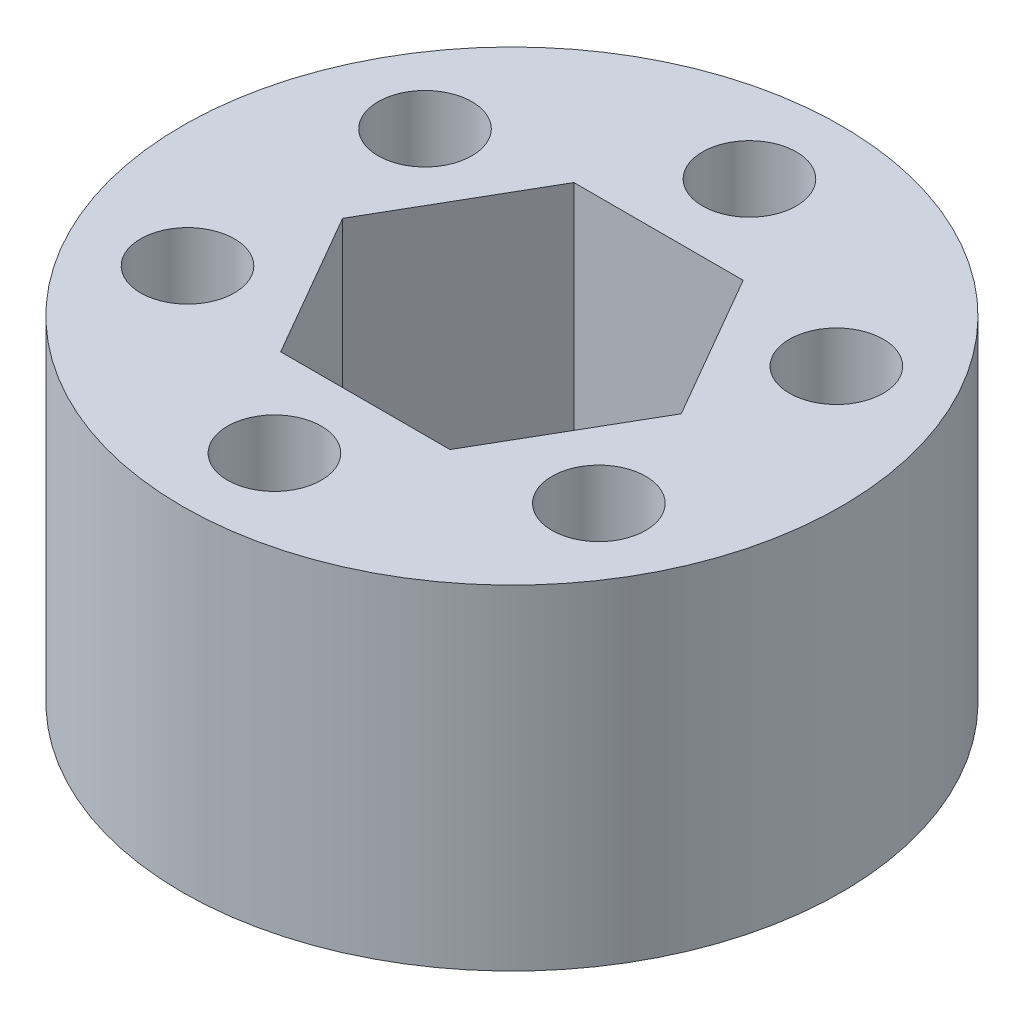
ISO-10303-21;
HEADER;
FILE_DESCRIPTION(('STEP AP214'),'2;1');
FILE_NAME('part.step','',(''),(''),'','','');
FILE_SCHEMA(('AUTOMOTIVE_DESIGN { 1 0 10303 214 1 1 1 1 }'));
ENDSEC;
DATA;
#1=APPLICATION_CONTEXT('core data for automotive mechanical design processes');
#2=APPLICATION_PROTOCOL_DEFINITION('international standard','automotive_design',2000,#1);
#3=PRODUCT_CONTEXT('',#1,'mechanical');
#4=PRODUCT('Part','Part','',(#3));
#5=PRODUCT_RELATED_PRODUCT_CATEGORY('part','',(#4));
#6=PRODUCT_DEFINITION_FORMATION('','',#4);
#7=PRODUCT_DEFINITION_CONTEXT('part definition',#1,'design');
#8=PRODUCT_DEFINITION('design','',#6,#7);
#9=PRODUCT_DEFINITION_SHAPE('','',#8);
#10=(LENGTH_UNIT() NAMED_UNIT(*) SI_UNIT(.MILLI.,.METRE.));
#11=(NAMED_UNIT(*) PLANE_ANGLE_UNIT() SI_UNIT($,.RADIAN.));
#12=(NAMED_UNIT(*) SI_UNIT($,.STERADIAN.) SOLID_ANGLE_UNIT());
#13=UNCERTAINTY_MEASURE_WITH_UNIT(LENGTH_MEASURE(1.E-05),#10,'distance_accuracy_value','');
#14=(GEOMETRIC_REPRESENTATION_CONTEXT(3) GLOBAL_UNCERTAINTY_ASSIGNED_CONTEXT((#13)) GLOBAL_UNIT_ASSIGNED_CONTEXT((#10,
#11,#12)) REPRESENTATION_CONTEXT('',''));
#15=CARTESIAN_POINT('',(0.,0.,0.));
#16=DIRECTION('',(0.,0.,1.));
#17=DIRECTION('',(1.,0.,0.));
#18=AXIS2_PLACEMENT_3D('',#15,#16,#17);
#19=CARTESIAN_POINT('',(0.,14.478,0.));
#20=DIRECTION('',(0.,1.,0.));
#21=DIRECTION('',(0.,0.,1.));
#22=AXIS2_PLACEMENT_3D('',#19,#20,#21);
#23=PLANE('',#22);
#24=CARTESIAN_POINT('',(-8.9088033287305,14.478,5.14350000000005));
#25=DIRECTION('',(0.,1.,0.));
#26=DIRECTION('',(0.,0.,1.));
#27=AXIS2_PLACEMENT_3D('',#24,#25,#26);
#28=CIRCLE('',#27,2.032);
#29=CARTESIAN_POINT('',(-8.9088033287305,14.478,7.17550000000004));
#30=VERTEX_POINT('',#29);
#31=EDGE_CURVE('E143',#30,#30,#28,.T.);
#32=ORIENTED_EDGE('',*,*,#31,.F.);
#33=EDGE_LOOP('',(#32));
#34=FACE_BOUND('',#33,.T.);
#35=CARTESIAN_POINT('',(8.90880332873054,14.478,5.14349999999998));
#36=DIRECTION('',(0.,1.,0.));
#37=DIRECTION('',(0.,0.,1.));
#38=AXIS2_PLACEMENT_3D('',#35,#36,#37);
#39=CIRCLE('',#38,2.032);
#40=CARTESIAN_POINT('',(8.90880332873054,14.478,7.17549999999998));
#41=VERTEX_POINT('',#40);
#42=EDGE_CURVE('E155',#41,#41,#39,.T.);
#43=ORIENTED_EDGE('',*,*,#42,.F.);
#44=EDGE_LOOP('',(#43));
#45=FACE_BOUND('',#44,.T.);
#46=CARTESIAN_POINT('',(0.,14.478,-10.287));
#47=DIRECTION('',(0.,1.,0.));
#48=DIRECTION('',(0.,0.,1.));
#49=AXIS2_PLACEMENT_3D('',#46,#47,#48);
#50=CIRCLE('',#49,2.032);
#51=CARTESIAN_POINT('',(0.,14.478,-8.255));
#52=VERTEX_POINT('',#51);
#53=EDGE_CURVE('E167',#52,#52,#50,.T.);
#54=ORIENTED_EDGE('',*,*,#53,.F.);
#55=EDGE_LOOP('',(#54));
#56=FACE_BOUND('',#55,.T.);
#57=CARTESIAN_POINT('',(0.,14.478,0.));
#58=DIRECTION('',(0.,1.,0.));
#59=DIRECTION('',(0.,0.,1.));
#60=AXIS2_PLACEMENT_3D('',#57,#58,#59);
#61=CIRCLE('',#60,14.2748);
#62=CARTESIAN_POINT('',(0.,14.478,14.2748));
#63=VERTEX_POINT('',#62);
#64=EDGE_CURVE('E11',#63,#63,#61,.T.);
#65=ORIENTED_EDGE('',*,*,#64,.T.);
#66=EDGE_LOOP('',(#65));
#67=FACE_BOUND('',#66,.T.);
#68=CARTESIAN_POINT('',(8.90880332873049,14.478,-5.14350000000005));
#69=DIRECTION('',(0.,1.,0.));
#70=DIRECTION('',(0.,0.,1.));
#71=AXIS2_PLACEMENT_3D('',#68,#69,#70);
#72=CIRCLE('',#71,2.032);
#73=CARTESIAN_POINT('',(8.90880332873049,14.478,-3.11150000000005));
#74=VERTEX_POINT('',#73);
#75=EDGE_CURVE('E161',#74,#74,#72,.T.);
#76=ORIENTED_EDGE('',*,*,#75,.F.);
#77=EDGE_LOOP('',(#76));
#78=FACE_BOUND('',#77,.T.);
#79=CARTESIAN_POINT('',(0.,14.478,10.287));
#80=DIRECTION('',(0.,1.,0.));
#81=DIRECTION('',(0.,0.,1.));
#82=AXIS2_PLACEMENT_3D('',#79,#80,#81);
#83=CIRCLE('',#82,2.032);
#84=CARTESIAN_POINT('',(0.,14.478,12.319));
#85=VERTEX_POINT('',#84);
#86=EDGE_CURVE('E149',#85,#85,#83,.T.);
#87=ORIENTED_EDGE('',*,*,#86,.F.);
#88=EDGE_LOOP('',(#87));
#89=FACE_BOUND('',#88,.T.);
#90=CARTESIAN_POINT('',(-8.90880332873054,14.478,-5.14349999999998));
#91=DIRECTION('',(0.,1.,0.));
#92=DIRECTION('',(0.,0.,1.));
#93=AXIS2_PLACEMENT_3D('',#90,#91,#92);
#94=CIRCLE('',#93,2.032);
#95=CARTESIAN_POINT('',(-8.90880332873054,14.478,-3.11149999999998));
#96=VERTEX_POINT('',#95);
#97=EDGE_CURVE('E137',#96,#96,#94,.T.);
#98=ORIENTED_EDGE('',*,*,#97,.F.);
#99=EDGE_LOOP('',(#98));
#100=FACE_BOUND('',#99,.T.);
#101=DIRECTION('',(-0.5,0.,-0.866025403784438));
#102=VECTOR('',#101,1.);
#103=CARTESIAN_POINT('',(7.33234841870825,14.478,0.));
#104=LINE('',#103,#102);
#105=CARTESIAN_POINT('',(7.33234841870825,14.478,0.));
#106=VERTEX_POINT('',#105);
#107=CARTESIAN_POINT('',(3.66617420935412,14.478,-6.35));
#108=VERTEX_POINT('',#107);
#109=EDGE_CURVE('E94',#106,#108,#104,.T.);
#110=ORIENTED_EDGE('',*,*,#109,.F.);
#111=DIRECTION('',(0.5,0.,-0.866025403784439));
#112=VECTOR('',#111,1.);
#113=CARTESIAN_POINT('',(3.66617420935413,14.478,6.35));
#114=LINE('',#113,#112);
#115=CARTESIAN_POINT('',(3.66617420935413,14.478,6.35));
#116=VERTEX_POINT('',#115);
#117=EDGE_CURVE('E86',#116,#106,#114,.T.);
#118=ORIENTED_EDGE('',*,*,#117,.F.);
#119=DIRECTION('',(1.,0.,0.));
#120=VECTOR('',#119,1.);
#121=CARTESIAN_POINT('',(-3.66617420935412,14.478,6.35));
#122=LINE('',#121,#120);
#123=CARTESIAN_POINT('',(-3.66617420935412,14.478,6.35));
#124=VERTEX_POINT('',#123);
#125=EDGE_CURVE('E115',#124,#116,#122,.T.);
#126=ORIENTED_EDGE('',*,*,#125,.F.);
#127=DIRECTION('',(0.5,0.,0.866025403784438));
#128=VECTOR('',#127,1.);
#129=CARTESIAN_POINT('',(-7.33234841870825,14.478,0.));
#130=LINE('',#129,#128);
#131=CARTESIAN_POINT('',(-7.33234841870825,14.478,0.));
#132=VERTEX_POINT('',#131);
#133=EDGE_CURVE('E113',#132,#124,#130,.T.);
#134=ORIENTED_EDGE('',*,*,#133,.F.);
#135=DIRECTION('',(-0.5,0.,0.866025403784439));
#136=VECTOR('',#135,1.);
#137=CARTESIAN_POINT('',(-3.66617420935412,14.478,-6.35));
#138=LINE('',#137,#136);
#139=CARTESIAN_POINT('',(-3.66617420935412,14.478,-6.35));
#140=VERTEX_POINT('',#139);
#141=EDGE_CURVE('E109',#140,#132,#138,.T.);
#142=ORIENTED_EDGE('',*,*,#141,.F.);
#143=DIRECTION('',(-1.,0.,0.));
#144=VECTOR('',#143,1.);
#145=CARTESIAN_POINT('',(3.66617420935412,14.478,-6.35));
#146=LINE('',#145,#144);
#147=EDGE_CURVE('E107',#108,#140,#146,.T.);
#148=ORIENTED_EDGE('',*,*,#147,.F.);
#149=EDGE_LOOP('',(#110,#118,#126,#134,#142,#148));
#150=FACE_BOUND('',#149,.T.);
#151=ADVANCED_FACE('F33',(#34,#45,#56,#67,#78,#89,#100,#150),#23,.T.);
#152=CARTESIAN_POINT('',(0.,0.,0.));
#153=DIRECTION('',(0.,1.,0.));
#154=DIRECTION('',(0.,0.,1.));
#155=AXIS2_PLACEMENT_3D('',#152,#153,#154);
#156=PLANE('',#155);
#157=CARTESIAN_POINT('',(-8.90880332873054,0.,-5.14349999999998));
#158=DIRECTION('',(0.,1.,0.));
#159=DIRECTION('',(0.,0.,1.));
#160=AXIS2_PLACEMENT_3D('',#157,#158,#159);
#161=CIRCLE('',#160,2.032);
#162=CARTESIAN_POINT('',(-8.90880332873054,0.,-3.11149999999998));
#163=VERTEX_POINT('',#162);
#164=EDGE_CURVE('E102',#163,#163,#161,.T.);
#165=ORIENTED_EDGE('',*,*,#164,.T.);
#166=EDGE_LOOP('',(#165));
#167=FACE_BOUND('',#166,.T.);
#168=CARTESIAN_POINT('',(-8.9088033287305,0.,5.14350000000005));
#169=DIRECTION('',(0.,1.,0.));
#170=DIRECTION('',(0.,0.,1.));
#171=AXIS2_PLACEMENT_3D('',#168,#169,#170);
#172=CIRCLE('',#171,2.032);
#173=CARTESIAN_POINT('',(-8.9088033287305,0.,7.17550000000004));
#174=VERTEX_POINT('',#173);
#175=EDGE_CURVE('E140',#174,#174,#172,.T.);
#176=ORIENTED_EDGE('',*,*,#175,.T.);
#177=EDGE_LOOP('',(#176));
#178=FACE_BOUND('',#177,.T.);
#179=CARTESIAN_POINT('',(0.,0.,10.287));
#180=DIRECTION('',(0.,1.,0.));
#181=DIRECTION('',(0.,0.,1.));
#182=AXIS2_PLACEMENT_3D('',#179,#180,#181);
#183=CIRCLE('',#182,2.032);
#184=CARTESIAN_POINT('',(0.,0.,12.319));
#185=VERTEX_POINT('',#184);
#186=EDGE_CURVE('E146',#185,#185,#183,.T.);
#187=ORIENTED_EDGE('',*,*,#186,.T.);
#188=EDGE_LOOP('',(#187));
#189=FACE_BOUND('',#188,.T.);
#190=CARTESIAN_POINT('',(8.90880332873054,0.,5.14349999999998));
#191=DIRECTION('',(0.,1.,0.));
#192=DIRECTION('',(0.,0.,1.));
#193=AXIS2_PLACEMENT_3D('',#190,#191,#192);
#194=CIRCLE('',#193,2.032);
#195=CARTESIAN_POINT('',(8.90880332873054,0.,7.17549999999998));
#196=VERTEX_POINT('',#195);
#197=EDGE_CURVE('E152',#196,#196,#194,.T.);
#198=ORIENTED_EDGE('',*,*,#197,.T.);
#199=EDGE_LOOP('',(#198));
#200=FACE_BOUND('',#199,.T.);
#201=CARTESIAN_POINT('',(8.90880332873049,0.,-5.14350000000005));
#202=DIRECTION('',(0.,1.,0.));
#203=DIRECTION('',(0.,0.,1.));
#204=AXIS2_PLACEMENT_3D('',#201,#202,#203);
#205=CIRCLE('',#204,2.032);
#206=CARTESIAN_POINT('',(8.90880332873049,0.,-3.11150000000005));
#207=VERTEX_POINT('',#206);
#208=EDGE_CURVE('E158',#207,#207,#205,.T.);
#209=ORIENTED_EDGE('',*,*,#208,.T.);
#210=EDGE_LOOP('',(#209));
#211=FACE_BOUND('',#210,.T.);
#212=CARTESIAN_POINT('',(0.,0.,-10.287));
#213=DIRECTION('',(0.,1.,0.));
#214=DIRECTION('',(0.,0.,1.));
#215=AXIS2_PLACEMENT_3D('',#212,#213,#214);
#216=CIRCLE('',#215,2.032);
#217=CARTESIAN_POINT('',(0.,0.,-8.255));
#218=VERTEX_POINT('',#217);
#219=EDGE_CURVE('E164',#218,#218,#216,.T.);
#220=ORIENTED_EDGE('',*,*,#219,.T.);
#221=EDGE_LOOP('',(#220));
#222=FACE_BOUND('',#221,.T.);
#223=CARTESIAN_POINT('',(0.,0.,0.));
#224=DIRECTION('',(0.,1.,0.));
#225=DIRECTION('',(0.,0.,1.));
#226=AXIS2_PLACEMENT_3D('',#223,#224,#225);
#227=CIRCLE('',#226,14.2748);
#228=CARTESIAN_POINT('',(0.,0.,14.2748));
#229=VERTEX_POINT('',#228);
#230=EDGE_CURVE('E37',#229,#229,#227,.T.);
#231=ORIENTED_EDGE('',*,*,#230,.F.);
#232=EDGE_LOOP('',(#231));
#233=FACE_BOUND('',#232,.T.);
#234=DIRECTION('',(0.5,0.,-0.866025403784439));
#235=VECTOR('',#234,1.);
#236=CARTESIAN_POINT('',(3.66617420935413,0.,6.35));
#237=LINE('',#236,#235);
#238=CARTESIAN_POINT('',(3.66617420935413,0.,6.35));
#239=VERTEX_POINT('',#238);
#240=CARTESIAN_POINT('',(7.33234841870825,0.,0.));
#241=VERTEX_POINT('',#240);
#242=EDGE_CURVE('E56',#239,#241,#237,.T.);
#243=ORIENTED_EDGE('',*,*,#242,.T.);
#244=DIRECTION('',(-0.5,0.,-0.866025403784438));
#245=VECTOR('',#244,1.);
#246=CARTESIAN_POINT('',(7.33234841870825,0.,0.));
#247=LINE('',#246,#245);
#248=CARTESIAN_POINT('',(3.66617420935412,0.,-6.35));
#249=VERTEX_POINT('',#248);
#250=EDGE_CURVE('E101',#241,#249,#247,.T.);
#251=ORIENTED_EDGE('',*,*,#250,.T.);
#252=DIRECTION('',(-1.,0.,0.));
#253=VECTOR('',#252,1.);
#254=CARTESIAN_POINT('',(3.66617420935412,0.,-6.35));
#255=LINE('',#254,#253);
#256=CARTESIAN_POINT('',(-3.66617420935412,0.,-6.35));
#257=VERTEX_POINT('',#256);
#258=EDGE_CURVE('E119',#249,#257,#255,.T.);
#259=ORIENTED_EDGE('',*,*,#258,.T.);
#260=DIRECTION('',(-0.5,0.,0.866025403784439));
#261=VECTOR('',#260,1.);
#262=CARTESIAN_POINT('',(-3.66617420935412,0.,-6.35));
#263=LINE('',#262,#261);
#264=CARTESIAN_POINT('',(-7.33234841870825,0.,0.));
#265=VERTEX_POINT('',#264);
#266=EDGE_CURVE('E122',#257,#265,#263,.T.);
#267=ORIENTED_EDGE('',*,*,#266,.T.);
#268=DIRECTION('',(0.5,0.,0.866025403784438));
#269=VECTOR('',#268,1.);
#270=CARTESIAN_POINT('',(-7.33234841870825,0.,0.));
#271=LINE('',#270,#269);
#272=CARTESIAN_POINT('',(-3.66617420935412,0.,6.35));
#273=VERTEX_POINT('',#272);
#274=EDGE_CURVE('E125',#265,#273,#271,.T.);
#275=ORIENTED_EDGE('',*,*,#274,.T.);
#276=DIRECTION('',(1.,0.,0.));
#277=VECTOR('',#276,1.);
#278=CARTESIAN_POINT('',(-3.66617420935412,0.,6.35));
#279=LINE('',#278,#277);
#280=EDGE_CURVE('E95',#273,#239,#279,.T.);
#281=ORIENTED_EDGE('',*,*,#280,.T.);
#282=EDGE_LOOP('',(#243,#251,#259,#267,#275,#281));
#283=FACE_BOUND('',#282,.T.);
#284=ADVANCED_FACE('F173',(#167,#178,#189,#200,#211,#222,#233,#283),#156,.F.);
#285=CARTESIAN_POINT('',(0.,14.478,0.));
#286=DIRECTION('',(0.,-1.,0.));
#287=DIRECTION('',(0.,0.,-1.));
#288=AXIS2_PLACEMENT_3D('',#285,#286,#287);
#289=CYLINDRICAL_SURFACE('',#288,14.2748);
#290=ORIENTED_EDGE('',*,*,#64,.F.);
#291=EDGE_LOOP('',(#290));
#292=FACE_BOUND('',#291,.T.);
#293=ORIENTED_EDGE('',*,*,#230,.T.);
#294=EDGE_LOOP('',(#293));
#295=FACE_BOUND('',#294,.T.);
#296=ADVANCED_FACE('F35',(#292,#295),#289,.T.);
#297=CARTESIAN_POINT('',(0.,14.478,-10.287));
#298=DIRECTION('',(0.,-1.,0.));
#299=DIRECTION('',(0.,0.,-1.));
#300=AXIS2_PLACEMENT_3D('',#297,#298,#299);
#301=CYLINDRICAL_SURFACE('',#300,2.032);
#302=ORIENTED_EDGE('',*,*,#53,.T.);
#303=EDGE_LOOP('',(#302));
#304=FACE_BOUND('',#303,.T.);
#305=ORIENTED_EDGE('',*,*,#219,.F.);
#306=EDGE_LOOP('',(#305));
#307=FACE_BOUND('',#306,.T.);
#308=ADVANCED_FACE('F176',(#304,#307),#301,.F.);
#309=CARTESIAN_POINT('',(8.90880332873049,14.478,-5.14350000000005));
#310=DIRECTION('',(0.,-1.,0.));
#311=DIRECTION('',(0.,0.,-1.));
#312=AXIS2_PLACEMENT_3D('',#309,#310,#311);
#313=CYLINDRICAL_SURFACE('',#312,2.032);
#314=ORIENTED_EDGE('',*,*,#75,.T.);
#315=EDGE_LOOP('',(#314));
#316=FACE_BOUND('',#315,.T.);
#317=ORIENTED_EDGE('',*,*,#208,.F.);
#318=EDGE_LOOP('',(#317));
#319=FACE_BOUND('',#318,.T.);
#320=ADVANCED_FACE('F178',(#316,#319),#313,.F.);
#321=CARTESIAN_POINT('',(8.90880332873054,14.478,5.14349999999998));
#322=DIRECTION('',(0.,-1.,0.));
#323=DIRECTION('',(0.,0.,-1.));
#324=AXIS2_PLACEMENT_3D('',#321,#322,#323);
#325=CYLINDRICAL_SURFACE('',#324,2.032);
#326=ORIENTED_EDGE('',*,*,#42,.T.);
#327=EDGE_LOOP('',(#326));
#328=FACE_BOUND('',#327,.T.);
#329=ORIENTED_EDGE('',*,*,#197,.F.);
#330=EDGE_LOOP('',(#329));
#331=FACE_BOUND('',#330,.T.);
#332=ADVANCED_FACE('F185',(#328,#331),#325,.F.);
#333=CARTESIAN_POINT('',(0.,14.478,10.287));
#334=DIRECTION('',(0.,-1.,0.));
#335=DIRECTION('',(0.,0.,-1.));
#336=AXIS2_PLACEMENT_3D('',#333,#334,#335);
#337=CYLINDRICAL_SURFACE('',#336,2.032);
#338=ORIENTED_EDGE('',*,*,#86,.T.);
#339=EDGE_LOOP('',(#338));
#340=FACE_BOUND('',#339,.T.);
#341=ORIENTED_EDGE('',*,*,#186,.F.);
#342=EDGE_LOOP('',(#341));
#343=FACE_BOUND('',#342,.T.);
#344=ADVANCED_FACE('F227',(#340,#343),#337,.F.);
#345=CARTESIAN_POINT('',(-8.9088033287305,14.478,5.14350000000005));
#346=DIRECTION('',(0.,-1.,0.));
#347=DIRECTION('',(0.,0.,-1.));
#348=AXIS2_PLACEMENT_3D('',#345,#346,#347);
#349=CYLINDRICAL_SURFACE('',#348,2.032);
#350=ORIENTED_EDGE('',*,*,#31,.T.);
#351=EDGE_LOOP('',(#350));
#352=FACE_BOUND('',#351,.T.);
#353=ORIENTED_EDGE('',*,*,#175,.F.);
#354=EDGE_LOOP('',(#353));
#355=FACE_BOUND('',#354,.T.);
#356=ADVANCED_FACE('F213',(#352,#355),#349,.F.);
#357=CARTESIAN_POINT('',(-8.90880332873054,14.478,-5.14349999999998));
#358=DIRECTION('',(0.,-1.,0.));
#359=DIRECTION('',(0.,0.,-1.));
#360=AXIS2_PLACEMENT_3D('',#357,#358,#359);
#361=CYLINDRICAL_SURFACE('',#360,2.032);
#362=ORIENTED_EDGE('',*,*,#97,.T.);
#363=EDGE_LOOP('',(#362));
#364=FACE_BOUND('',#363,.T.);
#365=ORIENTED_EDGE('',*,*,#164,.F.);
#366=EDGE_LOOP('',(#365));
#367=FACE_BOUND('',#366,.T.);
#368=ADVANCED_FACE('F210',(#364,#367),#361,.F.);
#369=CARTESIAN_POINT('',(3.66617420935413,14.478,6.35));
#370=DIRECTION('',(-0.866025403784439,0.,-0.5));
#371=DIRECTION('',(-0.5,0.,0.866025403784439));
#372=AXIS2_PLACEMENT_3D('',#369,#370,#371);
#373=PLANE('',#372);
#374=ORIENTED_EDGE('',*,*,#242,.F.);
#375=DIRECTION('',(0.,-1.,0.));
#376=VECTOR('',#375,1.);
#377=CARTESIAN_POINT('',(3.66617420935413,14.478,6.35));
#378=LINE('',#377,#376);
#379=EDGE_CURVE('E90',#116,#239,#378,.T.);
#380=ORIENTED_EDGE('',*,*,#379,.F.);
#381=ORIENTED_EDGE('',*,*,#117,.T.);
#382=DIRECTION('',(0.,-1.,0.));
#383=VECTOR('',#382,1.);
#384=CARTESIAN_POINT('',(7.33234841870825,14.478,0.));
#385=LINE('',#384,#383);
#386=EDGE_CURVE('E89',#106,#241,#385,.T.);
#387=ORIENTED_EDGE('',*,*,#386,.T.);
#388=EDGE_LOOP('',(#374,#380,#381,#387));
#389=FACE_BOUND('',#388,.T.);
#390=ADVANCED_FACE('F88',(#389),#373,.T.);
#391=CARTESIAN_POINT('',(7.33234841870825,14.478,0.));
#392=DIRECTION('',(-0.866025403784439,0.,0.5));
#393=DIRECTION('',(0.5,0.,0.866025403784439));
#394=AXIS2_PLACEMENT_3D('',#391,#392,#393);
#395=PLANE('',#394);
#396=ORIENTED_EDGE('',*,*,#250,.F.);
#397=ORIENTED_EDGE('',*,*,#386,.F.);
#398=ORIENTED_EDGE('',*,*,#109,.T.);
#399=DIRECTION('',(0.,-1.,0.));
#400=VECTOR('',#399,1.);
#401=CARTESIAN_POINT('',(3.66617420935412,14.478,-6.35));
#402=LINE('',#401,#400);
#403=EDGE_CURVE('E103',#108,#249,#402,.T.);
#404=ORIENTED_EDGE('',*,*,#403,.T.);
#405=EDGE_LOOP('',(#396,#397,#398,#404));
#406=FACE_BOUND('',#405,.T.);
#407=ADVANCED_FACE('F98',(#406),#395,.T.);
#408=CARTESIAN_POINT('',(3.66617420935412,14.478,-6.35));
#409=DIRECTION('',(0.,0.,1.));
#410=DIRECTION('',(1.,0.,0.));
#411=AXIS2_PLACEMENT_3D('',#408,#409,#410);
#412=PLANE('',#411);
#413=ORIENTED_EDGE('',*,*,#258,.F.);
#414=ORIENTED_EDGE('',*,*,#403,.F.);
#415=ORIENTED_EDGE('',*,*,#147,.T.);
#416=DIRECTION('',(0.,-1.,0.));
#417=VECTOR('',#416,1.);
#418=CARTESIAN_POINT('',(-3.66617420935412,14.478,-6.35));
#419=LINE('',#418,#417);
#420=EDGE_CURVE('E134',#140,#257,#419,.T.);
#421=ORIENTED_EDGE('',*,*,#420,.T.);
#422=EDGE_LOOP('',(#413,#414,#415,#421));
#423=FACE_BOUND('',#422,.T.);
#424=ADVANCED_FACE('F243',(#423),#412,.T.);
#425=CARTESIAN_POINT('',(-3.66617420935412,14.478,-6.35));
#426=DIRECTION('',(0.866025403784439,0.,0.5));
#427=DIRECTION('',(0.5,0.,-0.866025403784439));
#428=AXIS2_PLACEMENT_3D('',#425,#426,#427);
#429=PLANE('',#428);
#430=ORIENTED_EDGE('',*,*,#266,.F.);
#431=ORIENTED_EDGE('',*,*,#420,.F.);
#432=ORIENTED_EDGE('',*,*,#141,.T.);
#433=DIRECTION('',(0.,-1.,0.));
#434=VECTOR('',#433,1.);
#435=CARTESIAN_POINT('',(-7.33234841870825,14.478,0.));
#436=LINE('',#435,#434);
#437=EDGE_CURVE('E132',#132,#265,#436,.T.);
#438=ORIENTED_EDGE('',*,*,#437,.T.);
#439=EDGE_LOOP('',(#430,#431,#432,#438));
#440=FACE_BOUND('',#439,.T.);
#441=ADVANCED_FACE('F246',(#440),#429,.T.);
#442=CARTESIAN_POINT('',(-7.33234841870825,14.478,0.));
#443=DIRECTION('',(0.866025403784439,0.,-0.5));
#444=DIRECTION('',(-0.5,0.,-0.866025403784439));
#445=AXIS2_PLACEMENT_3D('',#442,#443,#444);
#446=PLANE('',#445);
#447=ORIENTED_EDGE('',*,*,#274,.F.);
#448=ORIENTED_EDGE('',*,*,#437,.F.);
#449=ORIENTED_EDGE('',*,*,#133,.T.);
#450=DIRECTION('',(0.,-1.,0.));
#451=VECTOR('',#450,1.);
#452=CARTESIAN_POINT('',(-3.66617420935412,14.478,6.35));
#453=LINE('',#452,#451);
#454=EDGE_CURVE('E48',#124,#273,#453,.T.);
#455=ORIENTED_EDGE('',*,*,#454,.T.);
#456=EDGE_LOOP('',(#447,#448,#449,#455));
#457=FACE_BOUND('',#456,.T.);
#458=ADVANCED_FACE('F250',(#457),#446,.T.);
#459=CARTESIAN_POINT('',(-3.66617420935412,14.478,6.35));
#460=DIRECTION('',(0.,0.,-1.));
#461=DIRECTION('',(-1.,0.,0.));
#462=AXIS2_PLACEMENT_3D('',#459,#460,#461);
#463=PLANE('',#462);
#464=ORIENTED_EDGE('',*,*,#280,.F.);
#465=ORIENTED_EDGE('',*,*,#454,.F.);
#466=ORIENTED_EDGE('',*,*,#125,.T.);
#467=ORIENTED_EDGE('',*,*,#379,.T.);
#468=EDGE_LOOP('',(#464,#465,#466,#467));
#469=FACE_BOUND('',#468,.T.);
#470=ADVANCED_FACE('F254',(#469),#463,.T.);
#471=CLOSED_SHELL('',(#151,#284,#296,#308,#320,#332,#344,#356,#368,#390,#407,#424,#441,#458,#470));
#472=MANIFOLD_SOLID_BREP('B2',#471);
#473=ADVANCED_BREP_SHAPE_REPRESENTATION('',(#18,#472),#14);
#474=SHAPE_DEFINITION_REPRESENTATION(#9,#473);
ENDSEC;
END-ISO-10303-21;
